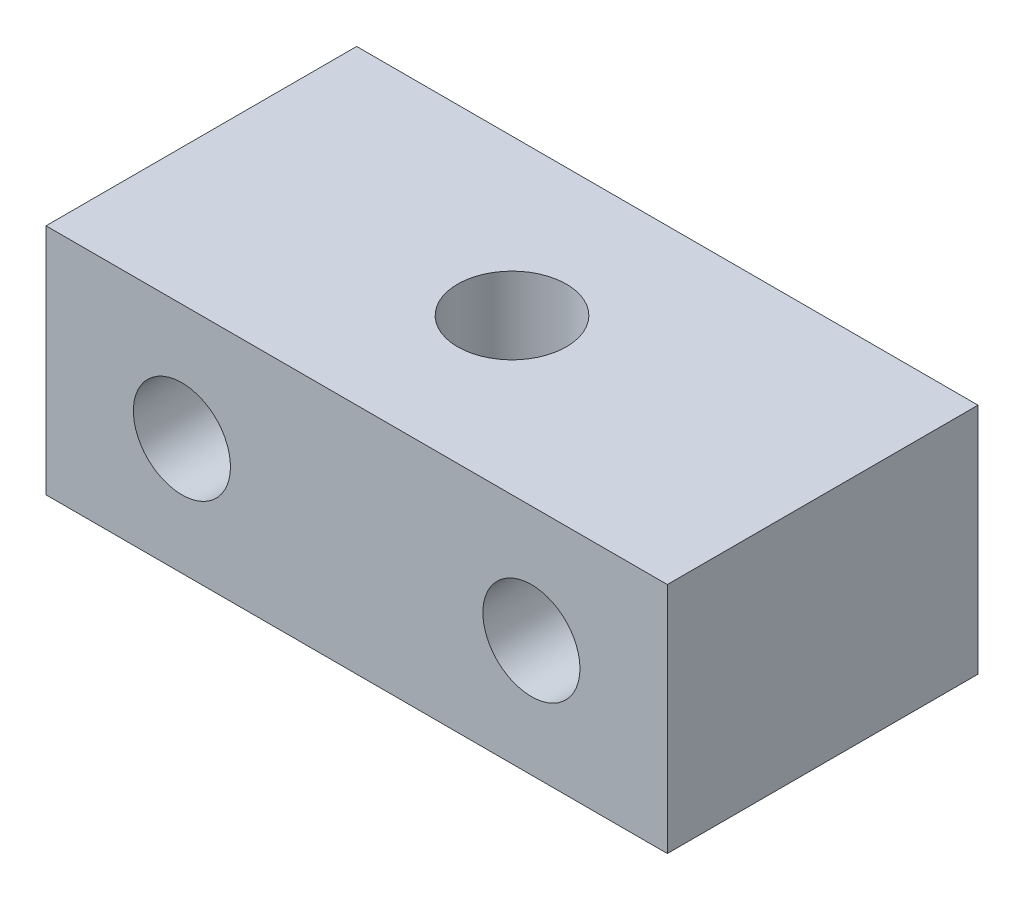
ISO-10303-21;
HEADER;
FILE_DESCRIPTION(('STEP AP214'),'2;1');
FILE_NAME('part.step','',(''),(''),'','','');
FILE_SCHEMA(('AUTOMOTIVE_DESIGN { 1 0 10303 214 1 1 1 1 }'));
ENDSEC;
DATA;
#1=APPLICATION_CONTEXT('core data for automotive mechanical design processes');
#2=APPLICATION_PROTOCOL_DEFINITION('international standard','automotive_design',2000,#1);
#3=PRODUCT_CONTEXT('',#1,'mechanical');
#4=PRODUCT('Part','Part','',(#3));
#5=PRODUCT_RELATED_PRODUCT_CATEGORY('part','',(#4));
#6=PRODUCT_DEFINITION_FORMATION('','',#4);
#7=PRODUCT_DEFINITION_CONTEXT('part definition',#1,'design');
#8=PRODUCT_DEFINITION('design','',#6,#7);
#9=PRODUCT_DEFINITION_SHAPE('','',#8);
#10=(LENGTH_UNIT() NAMED_UNIT(*) SI_UNIT(.MILLI.,.METRE.));
#11=(NAMED_UNIT(*) PLANE_ANGLE_UNIT() SI_UNIT($,.RADIAN.));
#12=(NAMED_UNIT(*) SI_UNIT($,.STERADIAN.) SOLID_ANGLE_UNIT());
#13=UNCERTAINTY_MEASURE_WITH_UNIT(LENGTH_MEASURE(1.E-05),#10,'distance_accuracy_value','');
#14=(GEOMETRIC_REPRESENTATION_CONTEXT(3) GLOBAL_UNCERTAINTY_ASSIGNED_CONTEXT((#13)) GLOBAL_UNIT_ASSIGNED_CONTEXT((#10,
#11,#12)) REPRESENTATION_CONTEXT('',''));
#15=CARTESIAN_POINT('',(0.,0.,0.));
#16=DIRECTION('',(0.,0.,1.));
#17=DIRECTION('',(1.,0.,0.));
#18=AXIS2_PLACEMENT_3D('',#15,#16,#17);
#19=CARTESIAN_POINT('',(0.,0.,12.7));
#20=DIRECTION('',(0.,0.,1.));
#21=DIRECTION('',(1.,0.,0.));
#22=AXIS2_PLACEMENT_3D('',#19,#20,#21);
#23=PLANE('',#22);
#24=CARTESIAN_POINT('',(-14.2875,79.375,12.7));
#25=DIRECTION('',(0.,0.,1.));
#26=DIRECTION('',(1.,0.,0.));
#27=AXIS2_PLACEMENT_3D('',#24,#25,#26);
#28=CIRCLE('',#27,3.96875);
#29=CARTESIAN_POINT('',(-10.31875,79.375,12.7));
#30=VERTEX_POINT('',#29);
#31=EDGE_CURVE('E102',#30,#30,#28,.T.);
#32=ORIENTED_EDGE('',*,*,#31,.F.);
#33=EDGE_LOOP('',(#32));
#34=FACE_BOUND('',#33,.T.);
#35=DIRECTION('',(-1.,0.,0.));
#36=VECTOR('',#35,1.);
#37=CARTESIAN_POINT('',(25.4,88.9,12.7));
#38=LINE('',#37,#36);
#39=CARTESIAN_POINT('',(25.4,88.9,12.7));
#40=VERTEX_POINT('',#39);
#41=CARTESIAN_POINT('',(-25.4,88.9,12.7));
#42=VERTEX_POINT('',#41);
#43=EDGE_CURVE('E86',#40,#42,#38,.T.);
#44=ORIENTED_EDGE('',*,*,#43,.T.);
#45=DIRECTION('',(0.,-1.,0.));
#46=VECTOR('',#45,1.);
#47=CARTESIAN_POINT('',(-25.4,88.9,12.7));
#48=LINE('',#47,#46);
#49=CARTESIAN_POINT('',(-25.4,69.85,12.7));
#50=VERTEX_POINT('',#49);
#51=EDGE_CURVE('E81',#42,#50,#48,.T.);
#52=ORIENTED_EDGE('',*,*,#51,.T.);
#53=DIRECTION('',(1.,0.,0.));
#54=VECTOR('',#53,1.);
#55=CARTESIAN_POINT('',(-25.4,69.85,12.7));
#56=LINE('',#55,#54);
#57=CARTESIAN_POINT('',(25.4,69.85,12.7));
#58=VERTEX_POINT('',#57);
#59=EDGE_CURVE('E84',#50,#58,#56,.T.);
#60=ORIENTED_EDGE('',*,*,#59,.T.);
#61=DIRECTION('',(0.,1.,0.));
#62=VECTOR('',#61,1.);
#63=CARTESIAN_POINT('',(25.4,69.85,12.7));
#64=LINE('',#63,#62);
#65=EDGE_CURVE('E51',#58,#40,#64,.T.);
#66=ORIENTED_EDGE('',*,*,#65,.T.);
#67=EDGE_LOOP('',(#44,#52,#60,#66));
#68=FACE_BOUND('',#67,.T.);
#69=CARTESIAN_POINT('',(14.2875,79.375,12.7));
#70=DIRECTION('',(0.,0.,1.));
#71=DIRECTION('',(1.,0.,0.));
#72=AXIS2_PLACEMENT_3D('',#69,#70,#71);
#73=CIRCLE('',#72,3.96875);
#74=CARTESIAN_POINT('',(18.25625,79.375,12.7));
#75=VERTEX_POINT('',#74);
#76=EDGE_CURVE('E117',#75,#75,#73,.T.);
#77=ORIENTED_EDGE('',*,*,#76,.F.);
#78=EDGE_LOOP('',(#77));
#79=FACE_BOUND('',#78,.T.);
#80=ADVANCED_FACE('F33',(#34,#68,#79),#23,.T.);
#81=CARTESIAN_POINT('',(0.,0.,-12.7));
#82=DIRECTION('',(0.,0.,1.));
#83=DIRECTION('',(1.,0.,0.));
#84=AXIS2_PLACEMENT_3D('',#81,#82,#83);
#85=PLANE('',#84);
#86=DIRECTION('',(-1.,0.,0.));
#87=VECTOR('',#86,1.);
#88=CARTESIAN_POINT('',(25.4,88.9,-12.7));
#89=LINE('',#88,#87);
#90=CARTESIAN_POINT('',(25.4,88.9,-12.7));
#91=VERTEX_POINT('',#90);
#92=CARTESIAN_POINT('',(-25.4,88.9,-12.7));
#93=VERTEX_POINT('',#92);
#94=EDGE_CURVE('E99',#91,#93,#89,.T.);
#95=ORIENTED_EDGE('',*,*,#94,.F.);
#96=DIRECTION('',(0.,1.,0.));
#97=VECTOR('',#96,1.);
#98=CARTESIAN_POINT('',(25.4,69.85,-12.7));
#99=LINE('',#98,#97);
#100=CARTESIAN_POINT('',(25.4,69.85,-12.7));
#101=VERTEX_POINT('',#100);
#102=EDGE_CURVE('E74',#101,#91,#99,.T.);
#103=ORIENTED_EDGE('',*,*,#102,.F.);
#104=DIRECTION('',(1.,0.,0.));
#105=VECTOR('',#104,1.);
#106=CARTESIAN_POINT('',(-25.4,69.85,-12.7));
#107=LINE('',#106,#105);
#108=CARTESIAN_POINT('',(-25.4,69.85,-12.7));
#109=VERTEX_POINT('',#108);
#110=EDGE_CURVE('E68',#109,#101,#107,.T.);
#111=ORIENTED_EDGE('',*,*,#110,.F.);
#112=DIRECTION('',(0.,-1.,0.));
#113=VECTOR('',#112,1.);
#114=CARTESIAN_POINT('',(-25.4,88.9,-12.7));
#115=LINE('',#114,#113);
#116=EDGE_CURVE('E90',#93,#109,#115,.T.);
#117=ORIENTED_EDGE('',*,*,#116,.F.);
#118=EDGE_LOOP('',(#95,#103,#111,#117));
#119=FACE_BOUND('',#118,.T.);
#120=CARTESIAN_POINT('',(-14.2875,79.375,-12.7));
#121=DIRECTION('',(0.,0.,1.));
#122=DIRECTION('',(1.,0.,0.));
#123=AXIS2_PLACEMENT_3D('',#120,#121,#122);
#124=CIRCLE('',#123,3.96875);
#125=CARTESIAN_POINT('',(-10.31875,79.375,-12.7));
#126=VERTEX_POINT('',#125);
#127=EDGE_CURVE('E114',#126,#126,#124,.T.);
#128=ORIENTED_EDGE('',*,*,#127,.T.);
#129=EDGE_LOOP('',(#128));
#130=FACE_BOUND('',#129,.T.);
#131=CARTESIAN_POINT('',(14.2875,79.375,-12.7));
#132=DIRECTION('',(0.,0.,1.));
#133=DIRECTION('',(1.,0.,0.));
#134=AXIS2_PLACEMENT_3D('',#131,#132,#133);
#135=CIRCLE('',#134,3.96875);
#136=CARTESIAN_POINT('',(18.25625,79.375,-12.7));
#137=VERTEX_POINT('',#136);
#138=EDGE_CURVE('E120',#137,#137,#135,.T.);
#139=ORIENTED_EDGE('',*,*,#138,.T.);
#140=EDGE_LOOP('',(#139));
#141=FACE_BOUND('',#140,.T.);
#142=ADVANCED_FACE('F110',(#119,#130,#141),#85,.F.);
#143=CARTESIAN_POINT('',(25.4,88.9,12.7));
#144=DIRECTION('',(0.,-1.,0.));
#145=DIRECTION('',(0.,0.,-1.));
#146=AXIS2_PLACEMENT_3D('',#143,#144,#145);
#147=PLANE('',#146);
#148=CARTESIAN_POINT('',(0.,88.9,0.));
#149=DIRECTION('',(0.,1.,0.));
#150=DIRECTION('',(0.,0.,1.));
#151=AXIS2_PLACEMENT_3D('',#148,#149,#150);
#152=CIRCLE('',#151,4.445);
#153=CARTESIAN_POINT('',(0.,88.9,4.445));
#154=VERTEX_POINT('',#153);
#155=EDGE_CURVE('E125',#154,#154,#152,.T.);
#156=ORIENTED_EDGE('',*,*,#155,.F.);
#157=EDGE_LOOP('',(#156));
#158=FACE_BOUND('',#157,.T.);
#159=ORIENTED_EDGE('',*,*,#94,.T.);
#160=DIRECTION('',(0.,0.,-1.));
#161=VECTOR('',#160,1.);
#162=CARTESIAN_POINT('',(-25.4,88.9,12.7));
#163=LINE('',#162,#161);
#164=EDGE_CURVE('E11',#42,#93,#163,.T.);
#165=ORIENTED_EDGE('',*,*,#164,.F.);
#166=ORIENTED_EDGE('',*,*,#43,.F.);
#167=DIRECTION('',(0.,0.,-1.));
#168=VECTOR('',#167,1.);
#169=CARTESIAN_POINT('',(25.4,88.9,12.7));
#170=LINE('',#169,#168);
#171=EDGE_CURVE('E95',#40,#91,#170,.T.);
#172=ORIENTED_EDGE('',*,*,#171,.T.);
#173=EDGE_LOOP('',(#159,#165,#166,#172));
#174=FACE_BOUND('',#173,.T.);
#175=ADVANCED_FACE('F35',(#158,#174),#147,.F.);
#176=CARTESIAN_POINT('',(-25.4,88.9,12.7));
#177=DIRECTION('',(1.,0.,0.));
#178=DIRECTION('',(0.,0.,-1.));
#179=AXIS2_PLACEMENT_3D('',#176,#177,#178);
#180=PLANE('',#179);
#181=ORIENTED_EDGE('',*,*,#116,.T.);
#182=DIRECTION('',(0.,0.,-1.));
#183=VECTOR('',#182,1.);
#184=CARTESIAN_POINT('',(-25.4,69.85,12.7));
#185=LINE('',#184,#183);
#186=EDGE_CURVE('E43',#50,#109,#185,.T.);
#187=ORIENTED_EDGE('',*,*,#186,.F.);
#188=ORIENTED_EDGE('',*,*,#51,.F.);
#189=ORIENTED_EDGE('',*,*,#164,.T.);
#190=EDGE_LOOP('',(#181,#187,#188,#189));
#191=FACE_BOUND('',#190,.T.);
#192=ADVANCED_FACE('F89',(#191),#180,.F.);
#193=CARTESIAN_POINT('',(-25.4,69.85,12.7));
#194=DIRECTION('',(0.,1.,0.));
#195=DIRECTION('',(0.,0.,1.));
#196=AXIS2_PLACEMENT_3D('',#193,#194,#195);
#197=PLANE('',#196);
#198=CARTESIAN_POINT('',(0.,69.85,0.));
#199=DIRECTION('',(0.,1.,0.));
#200=DIRECTION('',(0.,0.,1.));
#201=AXIS2_PLACEMENT_3D('',#198,#199,#200);
#202=CIRCLE('',#201,4.445);
#203=CARTESIAN_POINT('',(0.,69.85,4.445));
#204=VERTEX_POINT('',#203);
#205=EDGE_CURVE('E37',#204,#204,#202,.F.);
#206=ORIENTED_EDGE('',*,*,#205,.F.);
#207=EDGE_LOOP('',(#206));
#208=FACE_BOUND('',#207,.T.);
#209=ORIENTED_EDGE('',*,*,#110,.T.);
#210=DIRECTION('',(0.,0.,-1.));
#211=VECTOR('',#210,1.);
#212=CARTESIAN_POINT('',(25.4,69.85,12.7));
#213=LINE('',#212,#211);
#214=EDGE_CURVE('E91',#58,#101,#213,.T.);
#215=ORIENTED_EDGE('',*,*,#214,.F.);
#216=ORIENTED_EDGE('',*,*,#59,.F.);
#217=ORIENTED_EDGE('',*,*,#186,.T.);
#218=EDGE_LOOP('',(#209,#215,#216,#217));
#219=FACE_BOUND('',#218,.T.);
#220=ADVANCED_FACE('F93',(#208,#219),#197,.F.);
#221=CARTESIAN_POINT('',(25.4,69.85,12.7));
#222=DIRECTION('',(-1.,0.,0.));
#223=DIRECTION('',(0.,-1.,0.));
#224=AXIS2_PLACEMENT_3D('',#221,#222,#223);
#225=PLANE('',#224);
#226=ORIENTED_EDGE('',*,*,#102,.T.);
#227=ORIENTED_EDGE('',*,*,#171,.F.);
#228=ORIENTED_EDGE('',*,*,#65,.F.);
#229=ORIENTED_EDGE('',*,*,#214,.T.);
#230=EDGE_LOOP('',(#226,#227,#228,#229));
#231=FACE_BOUND('',#230,.T.);
#232=ADVANCED_FACE('F107',(#231),#225,.F.);
#233=CARTESIAN_POINT('',(-14.2875,79.375,12.7));
#234=DIRECTION('',(0.,0.,-1.));
#235=DIRECTION('',(-1.,0.,0.));
#236=AXIS2_PLACEMENT_3D('',#233,#234,#235);
#237=CYLINDRICAL_SURFACE('',#236,3.96875);
#238=ORIENTED_EDGE('',*,*,#31,.T.);
#239=EDGE_LOOP('',(#238));
#240=FACE_BOUND('',#239,.T.);
#241=ORIENTED_EDGE('',*,*,#127,.F.);
#242=EDGE_LOOP('',(#241));
#243=FACE_BOUND('',#242,.T.);
#244=ADVANCED_FACE('F140',(#240,#243),#237,.F.);
#245=CARTESIAN_POINT('',(14.2875,79.375,12.7));
#246=DIRECTION('',(0.,0.,-1.));
#247=DIRECTION('',(-1.,0.,0.));
#248=AXIS2_PLACEMENT_3D('',#245,#246,#247);
#249=CYLINDRICAL_SURFACE('',#248,3.96875);
#250=ORIENTED_EDGE('',*,*,#76,.T.);
#251=EDGE_LOOP('',(#250));
#252=FACE_BOUND('',#251,.T.);
#253=ORIENTED_EDGE('',*,*,#138,.F.);
#254=EDGE_LOOP('',(#253));
#255=FACE_BOUND('',#254,.T.);
#256=ADVANCED_FACE('F153',(#252,#255),#249,.F.);
#257=CARTESIAN_POINT('',(0.,88.9,0.));
#258=DIRECTION('',(0.,-1.,0.));
#259=DIRECTION('',(0.,0.,-1.));
#260=AXIS2_PLACEMENT_3D('',#257,#258,#259);
#261=CYLINDRICAL_SURFACE('',#260,4.445);
#262=ORIENTED_EDGE('',*,*,#155,.T.);
#263=EDGE_LOOP('',(#262));
#264=FACE_BOUND('',#263,.T.);
#265=ORIENTED_EDGE('',*,*,#205,.T.);
#266=EDGE_LOOP('',(#265));
#267=FACE_BOUND('',#266,.T.);
#268=ADVANCED_FACE('F132',(#264,#267),#261,.F.);
#269=CLOSED_SHELL('',(#80,#142,#175,#192,#220,#232,#244,#256,#268));
#270=MANIFOLD_SOLID_BREP('B2',#269);
#271=ADVANCED_BREP_SHAPE_REPRESENTATION('',(#18,#270),#14);
#272=SHAPE_DEFINITION_REPRESENTATION(#9,#271);
ENDSEC;
END-ISO-10303-21;
